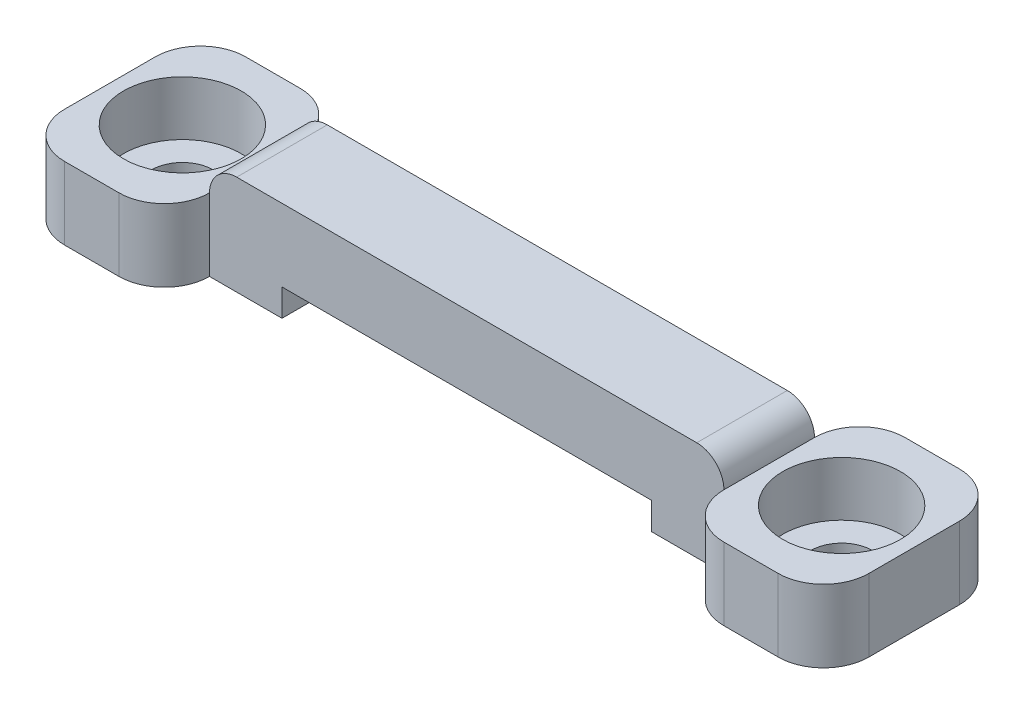
ISO-10303-21;
HEADER;
FILE_DESCRIPTION(('STEP AP214'),'2;1');
FILE_NAME('part.step','',(''),(''),'','','');
FILE_SCHEMA(('AUTOMOTIVE_DESIGN { 1 0 10303 214 1 1 1 1 }'));
ENDSEC;
DATA;
#1=APPLICATION_CONTEXT('core data for automotive mechanical design processes');
#2=APPLICATION_PROTOCOL_DEFINITION('international standard','automotive_design',2000,#1);
#3=PRODUCT_CONTEXT('',#1,'mechanical');
#4=PRODUCT('Part','Part','',(#3));
#5=PRODUCT_RELATED_PRODUCT_CATEGORY('part','',(#4));
#6=PRODUCT_DEFINITION_FORMATION('','',#4);
#7=PRODUCT_DEFINITION_CONTEXT('part definition',#1,'design');
#8=PRODUCT_DEFINITION('design','',#6,#7);
#9=PRODUCT_DEFINITION_SHAPE('','',#8);
#10=(LENGTH_UNIT() NAMED_UNIT(*) SI_UNIT(.MILLI.,.METRE.));
#11=(NAMED_UNIT(*) PLANE_ANGLE_UNIT() SI_UNIT($,.RADIAN.));
#12=(NAMED_UNIT(*) SI_UNIT($,.STERADIAN.) SOLID_ANGLE_UNIT());
#13=UNCERTAINTY_MEASURE_WITH_UNIT(LENGTH_MEASURE(1.E-05),#10,'distance_accuracy_value','');
#14=(GEOMETRIC_REPRESENTATION_CONTEXT(3) GLOBAL_UNCERTAINTY_ASSIGNED_CONTEXT((#13)) GLOBAL_UNIT_ASSIGNED_CONTEXT((#10,
#11,#12)) REPRESENTATION_CONTEXT('',''));
#15=CARTESIAN_POINT('',(0.,0.,0.));
#16=DIRECTION('',(0.,0.,1.));
#17=DIRECTION('',(1.,0.,0.));
#18=AXIS2_PLACEMENT_3D('',#15,#16,#17);
#19=CARTESIAN_POINT('',(0.,0.,0.));
#20=DIRECTION('',(0.,0.,1.));
#21=DIRECTION('',(1.,0.,0.));
#22=AXIS2_PLACEMENT_3D('',#19,#20,#21);
#23=PLANE('',#22);
#24=DIRECTION('',(-1.,0.,0.));
#25=VECTOR('',#24,1.);
#26=CARTESIAN_POINT('',(44.4,4.00000000000001,0.));
#27=LINE('',#26,#25);
#28=CARTESIAN_POINT('',(41.9,4.00000000000001,0.));
#29=VERTEX_POINT('',#28);
#30=CARTESIAN_POINT('',(38.9,4.00000000000001,0.));
#31=VERTEX_POINT('',#30);
#32=EDGE_CURVE('E411',#29,#31,#27,.T.);
#33=ORIENTED_EDGE('',*,*,#32,.F.);
#34=DIRECTION('',(0.,1.,0.));
#35=VECTOR('',#34,1.);
#36=CARTESIAN_POINT('',(41.9,0.,0.));
#37=LINE('',#36,#35);
#38=CARTESIAN_POINT('',(41.9,0.,0.));
#39=VERTEX_POINT('',#38);
#40=EDGE_CURVE('E245',#29,#39,#37,.F.);
#41=ORIENTED_EDGE('',*,*,#40,.T.);
#42=DIRECTION('',(1.,0.,0.));
#43=VECTOR('',#42,1.);
#44=CARTESIAN_POINT('',(32.4,0.,0.));
#45=LINE('',#44,#43);
#46=CARTESIAN_POINT('',(38.9,0.,0.));
#47=VERTEX_POINT('',#46);
#48=EDGE_CURVE('E407',#47,#39,#45,.T.);
#49=ORIENTED_EDGE('',*,*,#48,.F.);
#50=DIRECTION('',(0.,1.,0.));
#51=VECTOR('',#50,1.);
#52=CARTESIAN_POINT('',(38.9,0.,0.));
#53=LINE('',#52,#51);
#54=EDGE_CURVE('E218',#47,#31,#53,.T.);
#55=ORIENTED_EDGE('',*,*,#54,.T.);
#56=EDGE_LOOP('',(#33,#41,#49,#55));
#57=FACE_BOUND('',#56,.T.);
#58=ADVANCED_FACE('F39',(#57),#23,.F.);
#59=CARTESIAN_POINT('',(12.,0.,10.));
#60=DIRECTION('',(-1.,0.,0.));
#61=DIRECTION('',(0.,0.,1.));
#62=AXIS2_PLACEMENT_3D('',#59,#60,#61);
#63=PLANE('',#62);
#64=DIRECTION('',(0.,0.,-1.));
#65=VECTOR('',#64,1.);
#66=CARTESIAN_POINT('',(12.,0.,10.));
#67=LINE('',#66,#65);
#68=CARTESIAN_POINT('',(12.,0.,7.5));
#69=VERTEX_POINT('',#68);
#70=CARTESIAN_POINT('',(12.,0.,2.5));
#71=VERTEX_POINT('',#70);
#72=EDGE_CURVE('E320',#69,#71,#67,.T.);
#73=ORIENTED_EDGE('',*,*,#72,.T.);
#74=DIRECTION('',(0.,1.,0.));
#75=VECTOR('',#74,1.);
#76=CARTESIAN_POINT('',(12.,0.,2.5));
#77=LINE('',#76,#75);
#78=CARTESIAN_POINT('',(12.,1.5,2.5));
#79=VERTEX_POINT('',#78);
#80=EDGE_CURVE('E288',#71,#79,#77,.T.);
#81=ORIENTED_EDGE('',*,*,#80,.T.);
#82=DIRECTION('',(0.,0.,-1.));
#83=VECTOR('',#82,1.);
#84=CARTESIAN_POINT('',(12.,1.5,10.));
#85=LINE('',#84,#83);
#86=CARTESIAN_POINT('',(12.,1.5,7.5));
#87=VERTEX_POINT('',#86);
#88=EDGE_CURVE('E316',#87,#79,#85,.T.);
#89=ORIENTED_EDGE('',*,*,#88,.F.);
#90=DIRECTION('',(0.,1.,0.));
#91=VECTOR('',#90,1.);
#92=CARTESIAN_POINT('',(12.,0.,7.5));
#93=LINE('',#92,#91);
#94=EDGE_CURVE('E455',#69,#87,#93,.T.);
#95=ORIENTED_EDGE('',*,*,#94,.F.);
#96=EDGE_LOOP('',(#73,#81,#89,#95));
#97=FACE_BOUND('',#96,.T.);
#98=ADVANCED_FACE('F518',(#97),#63,.F.);
#99=CARTESIAN_POINT('',(12.,1.5,10.));
#100=DIRECTION('',(0.,1.,0.));
#101=DIRECTION('',(-1.,0.,0.));
#102=AXIS2_PLACEMENT_3D('',#99,#100,#101);
#103=PLANE('',#102);
#104=ORIENTED_EDGE('',*,*,#88,.T.);
#105=DIRECTION('',(1.,0.,0.));
#106=VECTOR('',#105,1.);
#107=CARTESIAN_POINT('',(12.,1.5,2.5));
#108=LINE('',#107,#106);
#109=CARTESIAN_POINT('',(32.4,1.50000000000001,2.5));
#110=VERTEX_POINT('',#109);
#111=EDGE_CURVE('E475',#79,#110,#108,.T.);
#112=ORIENTED_EDGE('',*,*,#111,.T.);
#113=DIRECTION('',(0.,0.,-1.));
#114=VECTOR('',#113,1.);
#115=CARTESIAN_POINT('',(32.4,1.50000000000001,10.));
#116=LINE('',#115,#114);
#117=CARTESIAN_POINT('',(32.4,1.50000000000001,7.5));
#118=VERTEX_POINT('',#117);
#119=EDGE_CURVE('E312',#118,#110,#116,.T.);
#120=ORIENTED_EDGE('',*,*,#119,.F.);
#121=DIRECTION('',(1.,0.,0.));
#122=VECTOR('',#121,1.);
#123=CARTESIAN_POINT('',(12.,1.5,7.5));
#124=LINE('',#123,#122);
#125=EDGE_CURVE('E458',#87,#118,#124,.T.);
#126=ORIENTED_EDGE('',*,*,#125,.F.);
#127=EDGE_LOOP('',(#104,#112,#120,#126));
#128=FACE_BOUND('',#127,.T.);
#129=ADVANCED_FACE('F520',(#128),#103,.F.);
#130=CARTESIAN_POINT('',(32.4,1.50000000000001,10.));
#131=DIRECTION('',(1.,0.,0.));
#132=DIRECTION('',(0.,0.,-1.));
#133=AXIS2_PLACEMENT_3D('',#130,#131,#132);
#134=PLANE('',#133);
#135=ORIENTED_EDGE('',*,*,#119,.T.);
#136=DIRECTION('',(0.,-1.,0.));
#137=VECTOR('',#136,1.);
#138=CARTESIAN_POINT('',(32.4,1.50000000000001,2.5));
#139=LINE('',#138,#137);
#140=CARTESIAN_POINT('',(32.4,0.,2.5));
#141=VERTEX_POINT('',#140);
#142=EDGE_CURVE('E479',#110,#141,#139,.T.);
#143=ORIENTED_EDGE('',*,*,#142,.T.);
#144=DIRECTION('',(0.,0.,-1.));
#145=VECTOR('',#144,1.);
#146=CARTESIAN_POINT('',(32.4,0.,10.));
#147=LINE('',#146,#145);
#148=CARTESIAN_POINT('',(32.4,0.,7.5));
#149=VERTEX_POINT('',#148);
#150=EDGE_CURVE('E211',#149,#141,#147,.T.);
#151=ORIENTED_EDGE('',*,*,#150,.F.);
#152=DIRECTION('',(0.,-1.,0.));
#153=VECTOR('',#152,1.);
#154=CARTESIAN_POINT('',(32.4,1.50000000000001,7.5));
#155=LINE('',#154,#153);
#156=EDGE_CURVE('E461',#118,#149,#155,.T.);
#157=ORIENTED_EDGE('',*,*,#156,.F.);
#158=EDGE_LOOP('',(#135,#143,#151,#157));
#159=FACE_BOUND('',#158,.T.);
#160=ADVANCED_FACE('F525',(#159),#134,.F.);
#161=CARTESIAN_POINT('',(36.4,5.5,10.));
#162=DIRECTION('',(0.,-1.,0.));
#163=DIRECTION('',(1.,0.,0.));
#164=AXIS2_PLACEMENT_3D('',#161,#162,#163);
#165=PLANE('',#164);
#166=DIRECTION('',(-1.,0.,0.));
#167=VECTOR('',#166,1.);
#168=CARTESIAN_POINT('',(8.,5.5,7.5));
#169=LINE('',#168,#167);
#170=CARTESIAN_POINT('',(34.9,5.5,7.5));
#171=VERTEX_POINT('',#170);
#172=CARTESIAN_POINT('',(9.5,5.5,7.5));
#173=VERTEX_POINT('',#172);
#174=EDGE_CURVE('E266',#171,#173,#169,.T.);
#175=ORIENTED_EDGE('',*,*,#174,.F.);
#176=DIRECTION('',(0.,0.,-1.));
#177=VECTOR('',#176,1.);
#178=CARTESIAN_POINT('',(34.9,5.5,10.));
#179=LINE('',#178,#177);
#180=CARTESIAN_POINT('',(34.9,5.5,2.5));
#181=VERTEX_POINT('',#180);
#182=EDGE_CURVE('E250',#171,#181,#179,.T.);
#183=ORIENTED_EDGE('',*,*,#182,.T.);
#184=DIRECTION('',(1.,0.,0.));
#185=VECTOR('',#184,1.);
#186=CARTESIAN_POINT('',(36.4,5.5,2.5));
#187=LINE('',#186,#185);
#188=CARTESIAN_POINT('',(9.5,5.5,2.5));
#189=VERTEX_POINT('',#188);
#190=EDGE_CURVE('E482',#189,#181,#187,.T.);
#191=ORIENTED_EDGE('',*,*,#190,.F.);
#192=DIRECTION('',(0.,0.,-1.));
#193=VECTOR('',#192,1.);
#194=CARTESIAN_POINT('',(9.5,5.5,10.));
#195=LINE('',#194,#193);
#196=EDGE_CURVE('E55',#189,#173,#195,.F.);
#197=ORIENTED_EDGE('',*,*,#196,.T.);
#198=EDGE_LOOP('',(#175,#183,#191,#197));
#199=FACE_BOUND('',#198,.T.);
#200=ADVANCED_FACE('F528',(#199),#165,.F.);
#201=CARTESIAN_POINT('',(0.,0.,10.));
#202=DIRECTION('',(0.,0.,1.));
#203=DIRECTION('',(1.,0.,0.));
#204=AXIS2_PLACEMENT_3D('',#201,#202,#203);
#205=PLANE('',#204);
#206=DIRECTION('',(1.,0.,0.));
#207=VECTOR('',#206,1.);
#208=CARTESIAN_POINT('',(0.,0.,10.));
#209=LINE('',#208,#207);
#210=CARTESIAN_POINT('',(2.5,0.,10.));
#211=VERTEX_POINT('',#210);
#212=CARTESIAN_POINT('',(5.5,0.,10.));
#213=VERTEX_POINT('',#212);
#214=EDGE_CURVE('E399',#211,#213,#209,.T.);
#215=ORIENTED_EDGE('',*,*,#214,.T.);
#216=DIRECTION('',(0.,-1.,0.));
#217=VECTOR('',#216,1.);
#218=CARTESIAN_POINT('',(5.5,4.,10.));
#219=LINE('',#218,#217);
#220=CARTESIAN_POINT('',(5.5,4.,10.));
#221=VERTEX_POINT('',#220);
#222=EDGE_CURVE('E343',#213,#221,#219,.F.);
#223=ORIENTED_EDGE('',*,*,#222,.T.);
#224=DIRECTION('',(-1.,0.,0.));
#225=VECTOR('',#224,1.);
#226=CARTESIAN_POINT('',(8.,4.,10.));
#227=LINE('',#226,#225);
#228=CARTESIAN_POINT('',(2.5,4.,10.));
#229=VERTEX_POINT('',#228);
#230=EDGE_CURVE('E277',#221,#229,#227,.T.);
#231=ORIENTED_EDGE('',*,*,#230,.T.);
#232=DIRECTION('',(0.,-1.,0.));
#233=VECTOR('',#232,1.);
#234=CARTESIAN_POINT('',(2.5,0.,10.));
#235=LINE('',#234,#233);
#236=EDGE_CURVE('E339',#229,#211,#235,.T.);
#237=ORIENTED_EDGE('',*,*,#236,.T.);
#238=EDGE_LOOP('',(#215,#223,#231,#237));
#239=FACE_BOUND('',#238,.T.);
#240=ADVANCED_FACE('F510',(#239),#205,.T.);
#241=CARTESIAN_POINT('',(0.,4.,10.));
#242=DIRECTION('',(1.,0.,0.));
#243=DIRECTION('',(0.,1.,0.));
#244=AXIS2_PLACEMENT_3D('',#241,#242,#243);
#245=PLANE('',#244);
#246=DIRECTION('',(0.,0.,-1.));
#247=VECTOR('',#246,1.);
#248=CARTESIAN_POINT('',(0.,0.,10.));
#249=LINE('',#248,#247);
#250=CARTESIAN_POINT('',(0.,0.,7.5));
#251=VERTEX_POINT('',#250);
#252=CARTESIAN_POINT('',(0.,0.,2.5));
#253=VERTEX_POINT('',#252);
#254=EDGE_CURVE('E324',#251,#253,#249,.T.);
#255=ORIENTED_EDGE('',*,*,#254,.F.);
#256=DIRECTION('',(0.,-1.,0.));
#257=VECTOR('',#256,1.);
#258=CARTESIAN_POINT('',(0.,4.,7.5));
#259=LINE('',#258,#257);
#260=CARTESIAN_POINT('',(0.,4.,7.5));
#261=VERTEX_POINT('',#260);
#262=EDGE_CURVE('E357',#251,#261,#259,.F.);
#263=ORIENTED_EDGE('',*,*,#262,.T.);
#264=DIRECTION('',(0.,0.,-1.));
#265=VECTOR('',#264,1.);
#266=CARTESIAN_POINT('',(0.,4.,10.));
#267=LINE('',#266,#265);
#268=CARTESIAN_POINT('',(0.,4.,2.5));
#269=VERTEX_POINT('',#268);
#270=EDGE_CURVE('E293',#261,#269,#267,.T.);
#271=ORIENTED_EDGE('',*,*,#270,.T.);
#272=DIRECTION('',(0.,-1.,0.));
#273=VECTOR('',#272,1.);
#274=CARTESIAN_POINT('',(0.,4.,2.5));
#275=LINE('',#274,#273);
#276=EDGE_CURVE('E281',#269,#253,#275,.T.);
#277=ORIENTED_EDGE('',*,*,#276,.T.);
#278=EDGE_LOOP('',(#255,#263,#271,#277));
#279=FACE_BOUND('',#278,.T.);
#280=ADVANCED_FACE('F505',(#279),#245,.F.);
#281=CARTESIAN_POINT('',(0.,0.,10.));
#282=DIRECTION('',(0.,1.,0.));
#283=DIRECTION('',(-1.,0.,0.));
#284=AXIS2_PLACEMENT_3D('',#281,#282,#283);
#285=PLANE('',#284);
#286=CARTESIAN_POINT('',(4.,0.,5.00000000000001));
#287=DIRECTION('',(0.,1.,0.));
#288=DIRECTION('',(0.,0.,1.));
#289=AXIS2_PLACEMENT_3D('',#286,#287,#288);
#290=CIRCLE('',#289,1.7);
#291=CARTESIAN_POINT('',(4.,0.,6.70000000000001));
#292=VERTEX_POINT('',#291);
#293=EDGE_CURVE('E439',#292,#292,#290,.T.);
#294=ORIENTED_EDGE('',*,*,#293,.T.);
#295=EDGE_LOOP('',(#294));
#296=FACE_BOUND('',#295,.T.);
#297=DIRECTION('',(1.,0.,0.));
#298=VECTOR('',#297,1.);
#299=CARTESIAN_POINT('',(8.,0.,7.5));
#300=LINE('',#299,#298);
#301=CARTESIAN_POINT('',(8.,0.,7.5));
#302=VERTEX_POINT('',#301);
#303=EDGE_CURVE('E469',#302,#69,#300,.T.);
#304=ORIENTED_EDGE('',*,*,#303,.F.);
#305=CARTESIAN_POINT('',(5.5,0.,7.5));
#306=DIRECTION('',(0.,1.,0.));
#307=DIRECTION('',(-1.,0.,0.));
#308=AXIS2_PLACEMENT_3D('',#305,#306,#307);
#309=CIRCLE('',#308,2.5);
#310=EDGE_CURVE('E285',#302,#213,#309,.F.);
#311=ORIENTED_EDGE('',*,*,#310,.T.);
#312=ORIENTED_EDGE('',*,*,#214,.F.);
#313=CARTESIAN_POINT('',(2.5,0.,7.5));
#314=DIRECTION('',(0.,1.,0.));
#315=DIRECTION('',(-1.,0.,0.));
#316=AXIS2_PLACEMENT_3D('',#313,#314,#315);
#317=CIRCLE('',#316,2.5);
#318=EDGE_CURVE('E334',#211,#251,#317,.F.);
#319=ORIENTED_EDGE('',*,*,#318,.T.);
#320=ORIENTED_EDGE('',*,*,#254,.T.);
#321=CARTESIAN_POINT('',(2.5,0.,2.5));
#322=DIRECTION('',(0.,1.,0.));
#323=DIRECTION('',(-1.,0.,0.));
#324=AXIS2_PLACEMENT_3D('',#321,#322,#323);
#325=CIRCLE('',#324,2.5);
#326=CARTESIAN_POINT('',(2.5,0.,0.));
#327=VERTEX_POINT('',#326);
#328=EDGE_CURVE('E331',#253,#327,#325,.F.);
#329=ORIENTED_EDGE('',*,*,#328,.T.);
#330=DIRECTION('',(1.,0.,0.));
#331=VECTOR('',#330,1.);
#332=CARTESIAN_POINT('',(0.,0.,0.));
#333=LINE('',#332,#331);
#334=CARTESIAN_POINT('',(5.5,0.,0.));
#335=VERTEX_POINT('',#334);
#336=EDGE_CURVE('E403',#327,#335,#333,.T.);
#337=ORIENTED_EDGE('',*,*,#336,.T.);
#338=CARTESIAN_POINT('',(5.5,0.,2.5));
#339=DIRECTION('',(0.,1.,0.));
#340=DIRECTION('',(-1.,0.,0.));
#341=AXIS2_PLACEMENT_3D('',#338,#339,#340);
#342=CIRCLE('',#341,2.5);
#343=CARTESIAN_POINT('',(8.,0.,2.5));
#344=VERTEX_POINT('',#343);
#345=EDGE_CURVE('E328',#335,#344,#342,.F.);
#346=ORIENTED_EDGE('',*,*,#345,.T.);
#347=DIRECTION('',(-1.,0.,0.));
#348=VECTOR('',#347,1.);
#349=CARTESIAN_POINT('',(36.4,0.,2.5));
#350=LINE('',#349,#348);
#351=EDGE_CURVE('E200',#71,#344,#350,.T.);
#352=ORIENTED_EDGE('',*,*,#351,.F.);
#353=ORIENTED_EDGE('',*,*,#72,.F.);
#354=EDGE_LOOP('',(#304,#311,#312,#319,#320,#329,#337,#346,#352,#353));
#355=FACE_BOUND('',#354,.T.);
#356=ADVANCED_FACE('F512',(#296,#355),#285,.F.);
#357=CARTESIAN_POINT('',(32.4,0.,10.));
#358=DIRECTION('',(0.,1.,0.));
#359=DIRECTION('',(-1.,0.,0.));
#360=AXIS2_PLACEMENT_3D('',#357,#358,#359);
#361=PLANE('',#360);
#362=CARTESIAN_POINT('',(40.4,0.,5.));
#363=DIRECTION('',(0.,1.,0.));
#364=DIRECTION('',(0.,0.,1.));
#365=AXIS2_PLACEMENT_3D('',#362,#363,#364);
#366=CIRCLE('',#365,1.7);
#367=CARTESIAN_POINT('',(40.4,0.,6.7));
#368=VERTEX_POINT('',#367);
#369=EDGE_CURVE('E408',#368,#368,#366,.T.);
#370=ORIENTED_EDGE('',*,*,#369,.T.);
#371=EDGE_LOOP('',(#370));
#372=FACE_BOUND('',#371,.T.);
#373=DIRECTION('',(1.,0.,0.));
#374=VECTOR('',#373,1.);
#375=CARTESIAN_POINT('',(32.4,0.,10.));
#376=LINE('',#375,#374);
#377=CARTESIAN_POINT('',(38.9,0.,10.));
#378=VERTEX_POINT('',#377);
#379=CARTESIAN_POINT('',(41.9,0.,10.));
#380=VERTEX_POINT('',#379);
#381=EDGE_CURVE('E387',#378,#380,#376,.T.);
#382=ORIENTED_EDGE('',*,*,#381,.F.);
#383=CARTESIAN_POINT('',(38.9,0.,7.5));
#384=DIRECTION('',(0.,1.,0.));
#385=DIRECTION('',(-1.,0.,0.));
#386=AXIS2_PLACEMENT_3D('',#383,#384,#385);
#387=CIRCLE('',#386,2.5);
#388=CARTESIAN_POINT('',(36.4,0.,7.5));
#389=VERTEX_POINT('',#388);
#390=EDGE_CURVE('E233',#378,#389,#387,.F.);
#391=ORIENTED_EDGE('',*,*,#390,.T.);
#392=EDGE_CURVE('E287',#149,#389,#300,.T.);
#393=ORIENTED_EDGE('',*,*,#392,.F.);
#394=ORIENTED_EDGE('',*,*,#150,.T.);
#395=CARTESIAN_POINT('',(36.4,0.,2.5));
#396=VERTEX_POINT('',#395);
#397=EDGE_CURVE('E192',#396,#141,#350,.T.);
#398=ORIENTED_EDGE('',*,*,#397,.F.);
#399=CARTESIAN_POINT('',(38.9,0.,2.5));
#400=DIRECTION('',(0.,1.,0.));
#401=DIRECTION('',(-1.,0.,0.));
#402=AXIS2_PLACEMENT_3D('',#399,#400,#401);
#403=CIRCLE('',#402,2.5);
#404=EDGE_CURVE('E207',#396,#47,#403,.F.);
#405=ORIENTED_EDGE('',*,*,#404,.T.);
#406=ORIENTED_EDGE('',*,*,#48,.T.);
#407=CARTESIAN_POINT('',(41.9,0.,2.5));
#408=DIRECTION('',(0.,1.,0.));
#409=DIRECTION('',(-1.,0.,0.));
#410=AXIS2_PLACEMENT_3D('',#407,#408,#409);
#411=CIRCLE('',#410,2.5);
#412=CARTESIAN_POINT('',(44.4,0.,2.5));
#413=VERTEX_POINT('',#412);
#414=EDGE_CURVE('E220',#39,#413,#411,.F.);
#415=ORIENTED_EDGE('',*,*,#414,.T.);
#416=DIRECTION('',(0.,0.,-1.));
#417=VECTOR('',#416,1.);
#418=CARTESIAN_POINT('',(44.4,0.,10.));
#419=LINE('',#418,#417);
#420=CARTESIAN_POINT('',(44.4,0.,7.5));
#421=VERTEX_POINT('',#420);
#422=EDGE_CURVE('E306',#421,#413,#419,.T.);
#423=ORIENTED_EDGE('',*,*,#422,.F.);
#424=CARTESIAN_POINT('',(41.9,0.,7.5));
#425=DIRECTION('',(0.,1.,0.));
#426=DIRECTION('',(-1.,0.,0.));
#427=AXIS2_PLACEMENT_3D('',#424,#425,#426);
#428=CIRCLE('',#427,2.5);
#429=EDGE_CURVE('E225',#421,#380,#428,.F.);
#430=ORIENTED_EDGE('',*,*,#429,.T.);
#431=EDGE_LOOP('',(#382,#391,#393,#394,#398,#405,#406,#415,#423,#430));
#432=FACE_BOUND('',#431,.T.);
#433=ADVANCED_FACE('F205',(#372,#432),#361,.F.);
#434=CARTESIAN_POINT('',(44.4,0.,10.));
#435=DIRECTION('',(-1.,0.,0.));
#436=DIRECTION('',(0.,0.,1.));
#437=AXIS2_PLACEMENT_3D('',#434,#435,#436);
#438=PLANE('',#437);
#439=DIRECTION('',(0.,0.,-1.));
#440=VECTOR('',#439,1.);
#441=CARTESIAN_POINT('',(44.4,4.00000000000001,10.));
#442=LINE('',#441,#440);
#443=CARTESIAN_POINT('',(44.4,4.00000000000001,7.5));
#444=VERTEX_POINT('',#443);
#445=CARTESIAN_POINT('',(44.4,4.00000000000001,2.5));
#446=VERTEX_POINT('',#445);
#447=EDGE_CURVE('E297',#444,#446,#442,.T.);
#448=ORIENTED_EDGE('',*,*,#447,.F.);
#449=DIRECTION('',(0.,1.,0.));
#450=VECTOR('',#449,1.);
#451=CARTESIAN_POINT('',(44.4,0.,7.5));
#452=LINE('',#451,#450);
#453=EDGE_CURVE('E240',#444,#421,#452,.F.);
#454=ORIENTED_EDGE('',*,*,#453,.T.);
#455=ORIENTED_EDGE('',*,*,#422,.T.);
#456=DIRECTION('',(0.,1.,0.));
#457=VECTOR('',#456,1.);
#458=CARTESIAN_POINT('',(44.4,0.,2.5));
#459=LINE('',#458,#457);
#460=EDGE_CURVE('E236',#413,#446,#459,.T.);
#461=ORIENTED_EDGE('',*,*,#460,.T.);
#462=EDGE_LOOP('',(#448,#454,#455,#461));
#463=FACE_BOUND('',#462,.T.);
#464=ADVANCED_FACE('F603',(#463),#438,.F.);
#465=CARTESIAN_POINT('',(44.4,4.00000000000001,10.));
#466=DIRECTION('',(0.,-1.,0.));
#467=DIRECTION('',(1.,0.,0.));
#468=AXIS2_PLACEMENT_3D('',#465,#466,#467);
#469=PLANE('',#468);
#470=CARTESIAN_POINT('',(40.4,4.00000000000001,5.));
#471=DIRECTION('',(0.,1.,0.));
#472=DIRECTION('',(0.,0.,1.));
#473=AXIS2_PLACEMENT_3D('',#470,#471,#472);
#474=CIRCLE('',#473,3.25);
#475=CARTESIAN_POINT('',(40.4,4.00000000000001,8.25));
#476=VERTEX_POINT('',#475);
#477=EDGE_CURVE('E435',#476,#476,#474,.T.);
#478=ORIENTED_EDGE('',*,*,#477,.F.);
#479=EDGE_LOOP('',(#478));
#480=FACE_BOUND('',#479,.T.);
#481=DIRECTION('',(0.,0.,-1.));
#482=VECTOR('',#481,1.);
#483=CARTESIAN_POINT('',(36.4,4.00000000000001,10.));
#484=LINE('',#483,#482);
#485=CARTESIAN_POINT('',(36.4,4.00000000000001,7.5));
#486=VERTEX_POINT('',#485);
#487=CARTESIAN_POINT('',(36.4,4.00000000000001,2.5));
#488=VERTEX_POINT('',#487);
#489=EDGE_CURVE('E292',#486,#488,#484,.T.);
#490=ORIENTED_EDGE('',*,*,#489,.F.);
#491=CARTESIAN_POINT('',(38.9,4.00000000000001,7.5));
#492=DIRECTION('',(0.,-1.,0.));
#493=DIRECTION('',(1.,0.,0.));
#494=AXIS2_PLACEMENT_3D('',#491,#492,#493);
#495=CIRCLE('',#494,2.5);
#496=CARTESIAN_POINT('',(38.9,4.00000000000001,10.));
#497=VERTEX_POINT('',#496);
#498=EDGE_CURVE('E375',#486,#497,#495,.F.);
#499=ORIENTED_EDGE('',*,*,#498,.T.);
#500=DIRECTION('',(-1.,0.,0.));
#501=VECTOR('',#500,1.);
#502=CARTESIAN_POINT('',(44.4,4.00000000000001,10.));
#503=LINE('',#502,#501);
#504=CARTESIAN_POINT('',(41.9,4.00000000000001,10.));
#505=VERTEX_POINT('',#504);
#506=EDGE_CURVE('E385',#505,#497,#503,.T.);
#507=ORIENTED_EDGE('',*,*,#506,.F.);
#508=CARTESIAN_POINT('',(41.9,4.00000000000001,7.5));
#509=DIRECTION('',(0.,-1.,0.));
#510=DIRECTION('',(1.,0.,0.));
#511=AXIS2_PLACEMENT_3D('',#508,#509,#510);
#512=CIRCLE('',#511,2.5);
#513=EDGE_CURVE('E372',#505,#444,#512,.F.);
#514=ORIENTED_EDGE('',*,*,#513,.T.);
#515=ORIENTED_EDGE('',*,*,#447,.T.);
#516=CARTESIAN_POINT('',(41.9,4.00000000000001,2.5));
#517=DIRECTION('',(0.,-1.,0.));
#518=DIRECTION('',(1.,0.,0.));
#519=AXIS2_PLACEMENT_3D('',#516,#517,#518);
#520=CIRCLE('',#519,2.5);
#521=EDGE_CURVE('E369',#446,#29,#520,.F.);
#522=ORIENTED_EDGE('',*,*,#521,.T.);
#523=ORIENTED_EDGE('',*,*,#32,.T.);
#524=CARTESIAN_POINT('',(38.9,4.00000000000001,2.5));
#525=DIRECTION('',(0.,-1.,0.));
#526=DIRECTION('',(1.,0.,0.));
#527=AXIS2_PLACEMENT_3D('',#524,#525,#526);
#528=CIRCLE('',#527,2.5);
#529=EDGE_CURVE('E366',#31,#488,#528,.F.);
#530=ORIENTED_EDGE('',*,*,#529,.T.);
#531=EDGE_LOOP('',(#490,#499,#507,#514,#515,#522,#523,#530));
#532=FACE_BOUND('',#531,.T.);
#533=ADVANCED_FACE('F392',(#480,#532),#469,.F.);
#534=CARTESIAN_POINT('',(8.,4.,10.));
#535=DIRECTION('',(0.,-1.,0.));
#536=DIRECTION('',(1.,0.,0.));
#537=AXIS2_PLACEMENT_3D('',#534,#535,#536);
#538=PLANE('',#537);
#539=CARTESIAN_POINT('',(4.,4.,5.00000000000001));
#540=DIRECTION('',(0.,1.,0.));
#541=DIRECTION('',(0.,0.,1.));
#542=AXIS2_PLACEMENT_3D('',#539,#540,#541);
#543=CIRCLE('',#542,3.25);
#544=CARTESIAN_POINT('',(4.,4.,8.25000000000001));
#545=VERTEX_POINT('',#544);
#546=EDGE_CURVE('E451',#545,#545,#543,.T.);
#547=ORIENTED_EDGE('',*,*,#546,.F.);
#548=EDGE_LOOP('',(#547));
#549=FACE_BOUND('',#548,.T.);
#550=ORIENTED_EDGE('',*,*,#230,.F.);
#551=CARTESIAN_POINT('',(5.5,4.,7.5));
#552=DIRECTION('',(0.,-1.,0.));
#553=DIRECTION('',(1.,0.,0.));
#554=AXIS2_PLACEMENT_3D('',#551,#552,#553);
#555=CIRCLE('',#554,2.5);
#556=CARTESIAN_POINT('',(8.,4.,7.5));
#557=VERTEX_POINT('',#556);
#558=EDGE_CURVE('E273',#221,#557,#555,.F.);
#559=ORIENTED_EDGE('',*,*,#558,.T.);
#560=DIRECTION('',(0.,0.,-1.));
#561=VECTOR('',#560,1.);
#562=CARTESIAN_POINT('',(8.,4.,10.));
#563=LINE('',#562,#561);
#564=CARTESIAN_POINT('',(8.,4.,2.5));
#565=VERTEX_POINT('',#564);
#566=EDGE_CURVE('E275',#557,#565,#563,.T.);
#567=ORIENTED_EDGE('',*,*,#566,.T.);
#568=CARTESIAN_POINT('',(5.5,4.,2.5));
#569=DIRECTION('',(0.,-1.,0.));
#570=DIRECTION('',(1.,0.,0.));
#571=AXIS2_PLACEMENT_3D('',#568,#569,#570);
#572=CIRCLE('',#571,2.5);
#573=CARTESIAN_POINT('',(5.5,4.,0.));
#574=VERTEX_POINT('',#573);
#575=EDGE_CURVE('E346',#565,#574,#572,.F.);
#576=ORIENTED_EDGE('',*,*,#575,.T.);
#577=DIRECTION('',(-1.,0.,0.));
#578=VECTOR('',#577,1.);
#579=CARTESIAN_POINT('',(8.,4.,0.));
#580=LINE('',#579,#578);
#581=CARTESIAN_POINT('',(2.5,4.,0.));
#582=VERTEX_POINT('',#581);
#583=EDGE_CURVE('E414',#574,#582,#580,.T.);
#584=ORIENTED_EDGE('',*,*,#583,.T.);
#585=CARTESIAN_POINT('',(2.5,4.,2.5));
#586=DIRECTION('',(0.,-1.,0.));
#587=DIRECTION('',(1.,0.,0.));
#588=AXIS2_PLACEMENT_3D('',#585,#586,#587);
#589=CIRCLE('',#588,2.5);
#590=EDGE_CURVE('E349',#582,#269,#589,.F.);
#591=ORIENTED_EDGE('',*,*,#590,.T.);
#592=ORIENTED_EDGE('',*,*,#270,.F.);
#593=CARTESIAN_POINT('',(2.5,4.,7.5));
#594=DIRECTION('',(0.,-1.,0.));
#595=DIRECTION('',(1.,0.,0.));
#596=AXIS2_PLACEMENT_3D('',#593,#594,#595);
#597=CIRCLE('',#596,2.5);
#598=EDGE_CURVE('E282',#261,#229,#597,.F.);
#599=ORIENTED_EDGE('',*,*,#598,.T.);
#600=EDGE_LOOP('',(#550,#559,#567,#576,#584,#591,#592,#599));
#601=FACE_BOUND('',#600,.T.);
#602=ADVANCED_FACE('F274',(#549,#601),#538,.F.);
#603=ORIENTED_EDGE('',*,*,#506,.T.);
#604=DIRECTION('',(0.,1.,0.));
#605=VECTOR('',#604,1.);
#606=CARTESIAN_POINT('',(38.9,0.,10.));
#607=LINE('',#606,#605);
#608=EDGE_CURVE('E221',#497,#378,#607,.F.);
#609=ORIENTED_EDGE('',*,*,#608,.T.);
#610=ORIENTED_EDGE('',*,*,#381,.T.);
#611=DIRECTION('',(0.,1.,0.));
#612=VECTOR('',#611,1.);
#613=CARTESIAN_POINT('',(41.9,4.00000000000001,10.));
#614=LINE('',#613,#612);
#615=EDGE_CURVE('E227',#380,#505,#614,.T.);
#616=ORIENTED_EDGE('',*,*,#615,.T.);
#617=EDGE_LOOP('',(#603,#609,#610,#616));
#618=FACE_BOUND('',#617,.T.);
#619=ADVANCED_FACE('F384',(#618),#205,.T.);
#620=ORIENTED_EDGE('',*,*,#336,.F.);
#621=DIRECTION('',(0.,-1.,0.));
#622=VECTOR('',#621,1.);
#623=CARTESIAN_POINT('',(2.5,0.,0.));
#624=LINE('',#623,#622);
#625=EDGE_CURVE('E363',#327,#582,#624,.F.);
#626=ORIENTED_EDGE('',*,*,#625,.T.);
#627=ORIENTED_EDGE('',*,*,#583,.F.);
#628=DIRECTION('',(0.,1.,0.));
#629=VECTOR('',#628,1.);
#630=CARTESIAN_POINT('',(5.5,0.,0.));
#631=LINE('',#630,#629);
#632=EDGE_CURVE('E360',#574,#335,#631,.F.);
#633=ORIENTED_EDGE('',*,*,#632,.T.);
#634=EDGE_LOOP('',(#620,#626,#627,#633));
#635=FACE_BOUND('',#634,.T.);
#636=ADVANCED_FACE('F496',(#635),#23,.F.);
#637=CARTESIAN_POINT('',(40.4,4.00000000000001,5.));
#638=DIRECTION('',(0.,1.,0.));
#639=DIRECTION('',(0.,0.,1.));
#640=AXIS2_PLACEMENT_3D('',#637,#638,#639);
#641=CYLINDRICAL_SURFACE('',#640,1.7);
#642=ORIENTED_EDGE('',*,*,#369,.F.);
#643=EDGE_LOOP('',(#642));
#644=FACE_BOUND('',#643,.T.);
#645=CARTESIAN_POINT('',(40.4,1.00000000000001,5.));
#646=DIRECTION('',(0.,1.,0.));
#647=DIRECTION('',(0.,0.,1.));
#648=AXIS2_PLACEMENT_3D('',#645,#646,#647);
#649=CIRCLE('',#648,1.7);
#650=CARTESIAN_POINT('',(40.4,1.00000000000001,6.7));
#651=VERTEX_POINT('',#650);
#652=EDGE_CURVE('E427',#651,#651,#649,.T.);
#653=ORIENTED_EDGE('',*,*,#652,.T.);
#654=EDGE_LOOP('',(#653));
#655=FACE_BOUND('',#654,.T.);
#656=ADVANCED_FACE('F548',(#644,#655),#641,.F.);
#657=CARTESIAN_POINT('',(42.1,1.00000000000001,5.));
#658=DIRECTION('',(0.,-1.,0.));
#659=DIRECTION('',(0.,0.,-1.));
#660=AXIS2_PLACEMENT_3D('',#657,#658,#659);
#661=PLANE('',#660);
#662=ORIENTED_EDGE('',*,*,#652,.F.);
#663=EDGE_LOOP('',(#662));
#664=FACE_BOUND('',#663,.T.);
#665=CARTESIAN_POINT('',(40.4,1.00000000000001,5.));
#666=DIRECTION('',(0.,1.,0.));
#667=DIRECTION('',(0.,0.,1.));
#668=AXIS2_PLACEMENT_3D('',#665,#666,#667);
#669=CIRCLE('',#668,3.25);
#670=CARTESIAN_POINT('',(40.4,1.00000000000001,8.25));
#671=VERTEX_POINT('',#670);
#672=EDGE_CURVE('E431',#671,#671,#669,.T.);
#673=ORIENTED_EDGE('',*,*,#672,.T.);
#674=EDGE_LOOP('',(#673));
#675=FACE_BOUND('',#674,.T.);
#676=ADVANCED_FACE('F553',(#664,#675),#661,.F.);
#677=CARTESIAN_POINT('',(40.4,4.00000000000001,5.));
#678=DIRECTION('',(0.,1.,0.));
#679=DIRECTION('',(0.,0.,1.));
#680=AXIS2_PLACEMENT_3D('',#677,#678,#679);
#681=CYLINDRICAL_SURFACE('',#680,3.25);
#682=ORIENTED_EDGE('',*,*,#672,.F.);
#683=EDGE_LOOP('',(#682));
#684=FACE_BOUND('',#683,.T.);
#685=ORIENTED_EDGE('',*,*,#477,.T.);
#686=EDGE_LOOP('',(#685));
#687=FACE_BOUND('',#686,.T.);
#688=ADVANCED_FACE('F625',(#684,#687),#681,.F.);
#689=CARTESIAN_POINT('',(4.,4.,5.00000000000001));
#690=DIRECTION('',(0.,1.,0.));
#691=DIRECTION('',(0.,0.,1.));
#692=AXIS2_PLACEMENT_3D('',#689,#690,#691);
#693=CYLINDRICAL_SURFACE('',#692,1.7);
#694=ORIENTED_EDGE('',*,*,#293,.F.);
#695=EDGE_LOOP('',(#694));
#696=FACE_BOUND('',#695,.T.);
#697=CARTESIAN_POINT('',(4.,0.999999999999997,5.00000000000001));
#698=DIRECTION('',(0.,1.,0.));
#699=DIRECTION('',(0.,0.,1.));
#700=AXIS2_PLACEMENT_3D('',#697,#698,#699);
#701=CIRCLE('',#700,1.7);
#702=CARTESIAN_POINT('',(4.,0.999999999999997,6.70000000000001));
#703=VERTEX_POINT('',#702);
#704=EDGE_CURVE('E443',#703,#703,#701,.T.);
#705=ORIENTED_EDGE('',*,*,#704,.T.);
#706=EDGE_LOOP('',(#705));
#707=FACE_BOUND('',#706,.T.);
#708=ADVANCED_FACE('F631',(#696,#707),#693,.F.);
#709=CARTESIAN_POINT('',(5.69999999999999,0.999999999999997,5.00000000000001));
#710=DIRECTION('',(0.,-1.,0.));
#711=DIRECTION('',(0.,0.,-1.));
#712=AXIS2_PLACEMENT_3D('',#709,#710,#711);
#713=PLANE('',#712);
#714=ORIENTED_EDGE('',*,*,#704,.F.);
#715=EDGE_LOOP('',(#714));
#716=FACE_BOUND('',#715,.T.);
#717=CARTESIAN_POINT('',(4.,0.999999999999997,5.00000000000001));
#718=DIRECTION('',(0.,1.,0.));
#719=DIRECTION('',(0.,0.,1.));
#720=AXIS2_PLACEMENT_3D('',#717,#718,#719);
#721=CIRCLE('',#720,3.25);
#722=CARTESIAN_POINT('',(4.,0.999999999999997,8.25000000000001));
#723=VERTEX_POINT('',#722);
#724=EDGE_CURVE('E447',#723,#723,#721,.T.);
#725=ORIENTED_EDGE('',*,*,#724,.T.);
#726=EDGE_LOOP('',(#725));
#727=FACE_BOUND('',#726,.T.);
#728=ADVANCED_FACE('F637',(#716,#727),#713,.F.);
#729=CARTESIAN_POINT('',(4.,4.,5.00000000000001));
#730=DIRECTION('',(0.,1.,0.));
#731=DIRECTION('',(0.,0.,1.));
#732=AXIS2_PLACEMENT_3D('',#729,#730,#731);
#733=CYLINDRICAL_SURFACE('',#732,3.25);
#734=ORIENTED_EDGE('',*,*,#724,.F.);
#735=EDGE_LOOP('',(#734));
#736=FACE_BOUND('',#735,.T.);
#737=ORIENTED_EDGE('',*,*,#546,.T.);
#738=EDGE_LOOP('',(#737));
#739=FACE_BOUND('',#738,.T.);
#740=ADVANCED_FACE('F643',(#736,#739),#733,.F.);
#741=CARTESIAN_POINT('',(0.,0.,7.5));
#742=DIRECTION('',(0.,0.,1.));
#743=DIRECTION('',(1.,0.,0.));
#744=AXIS2_PLACEMENT_3D('',#741,#742,#743);
#745=PLANE('',#744);
#746=DIRECTION('',(0.,1.,0.));
#747=VECTOR('',#746,1.);
#748=CARTESIAN_POINT('',(36.4,5.5,7.5));
#749=LINE('',#748,#747);
#750=EDGE_CURVE('E466',#389,#486,#749,.T.);
#751=ORIENTED_EDGE('',*,*,#750,.T.);
#752=CARTESIAN_POINT('',(34.9,4.,7.5));
#753=DIRECTION('',(0.,0.,1.));
#754=DIRECTION('',(1.,0.,0.));
#755=AXIS2_PLACEMENT_3D('',#752,#753,#754);
#756=CIRCLE('',#755,1.5);
#757=EDGE_CURVE('E11',#486,#171,#756,.T.);
#758=ORIENTED_EDGE('',*,*,#757,.T.);
#759=ORIENTED_EDGE('',*,*,#174,.T.);
#760=CARTESIAN_POINT('',(9.5,4.,7.5));
#761=DIRECTION('',(0.,0.,1.));
#762=DIRECTION('',(1.,0.,0.));
#763=AXIS2_PLACEMENT_3D('',#760,#761,#762);
#764=CIRCLE('',#763,1.5);
#765=EDGE_CURVE('E48',#173,#557,#764,.T.);
#766=ORIENTED_EDGE('',*,*,#765,.T.);
#767=DIRECTION('',(0.,-1.,0.));
#768=VECTOR('',#767,1.);
#769=CARTESIAN_POINT('',(8.,5.5,7.5));
#770=LINE('',#769,#768);
#771=EDGE_CURVE('E264',#557,#302,#770,.T.);
#772=ORIENTED_EDGE('',*,*,#771,.T.);
#773=ORIENTED_EDGE('',*,*,#303,.T.);
#774=ORIENTED_EDGE('',*,*,#94,.T.);
#775=ORIENTED_EDGE('',*,*,#125,.T.);
#776=ORIENTED_EDGE('',*,*,#156,.T.);
#777=ORIENTED_EDGE('',*,*,#392,.T.);
#778=EDGE_LOOP('',(#751,#758,#759,#766,#772,#773,#774,#775,#776,#777));
#779=FACE_BOUND('',#778,.T.);
#780=ADVANCED_FACE('F262',(#779),#745,.T.);
#781=CARTESIAN_POINT('',(0.,0.,2.5));
#782=DIRECTION('',(0.,0.,1.));
#783=DIRECTION('',(1.,0.,0.));
#784=AXIS2_PLACEMENT_3D('',#781,#782,#783);
#785=PLANE('',#784);
#786=ORIENTED_EDGE('',*,*,#190,.T.);
#787=CARTESIAN_POINT('',(34.9,4.,2.5));
#788=DIRECTION('',(0.,0.,1.));
#789=DIRECTION('',(1.,0.,0.));
#790=AXIS2_PLACEMENT_3D('',#787,#788,#789);
#791=CIRCLE('',#790,1.5);
#792=EDGE_CURVE('E194',#181,#488,#791,.F.);
#793=ORIENTED_EDGE('',*,*,#792,.T.);
#794=DIRECTION('',(0.,-1.,0.));
#795=VECTOR('',#794,1.);
#796=CARTESIAN_POINT('',(36.4,0.,2.5));
#797=LINE('',#796,#795);
#798=EDGE_CURVE('E188',#488,#396,#797,.T.);
#799=ORIENTED_EDGE('',*,*,#798,.T.);
#800=ORIENTED_EDGE('',*,*,#397,.T.);
#801=ORIENTED_EDGE('',*,*,#142,.F.);
#802=ORIENTED_EDGE('',*,*,#111,.F.);
#803=ORIENTED_EDGE('',*,*,#80,.F.);
#804=ORIENTED_EDGE('',*,*,#351,.T.);
#805=DIRECTION('',(0.,1.,0.));
#806=VECTOR('',#805,1.);
#807=CARTESIAN_POINT('',(8.,0.,2.5));
#808=LINE('',#807,#806);
#809=EDGE_CURVE('E213',#344,#565,#808,.T.);
#810=ORIENTED_EDGE('',*,*,#809,.T.);
#811=CARTESIAN_POINT('',(9.5,4.,2.5));
#812=DIRECTION('',(0.,0.,1.));
#813=DIRECTION('',(1.,0.,0.));
#814=AXIS2_PLACEMENT_3D('',#811,#812,#813);
#815=CIRCLE('',#814,1.5);
#816=EDGE_CURVE('E254',#565,#189,#815,.F.);
#817=ORIENTED_EDGE('',*,*,#816,.T.);
#818=EDGE_LOOP('',(#786,#793,#799,#800,#801,#802,#803,#804,#810,#817));
#819=FACE_BOUND('',#818,.T.);
#820=ADVANCED_FACE('F191',(#819),#785,.F.);
#821=CARTESIAN_POINT('',(5.5,5.5,7.5));
#822=DIRECTION('',(0.,1.,0.));
#823=DIRECTION('',(0.,0.,1.));
#824=AXIS2_PLACEMENT_3D('',#821,#822,#823);
#825=CYLINDRICAL_SURFACE('',#824,2.5);
#826=ORIENTED_EDGE('',*,*,#558,.F.);
#827=ORIENTED_EDGE('',*,*,#222,.F.);
#828=ORIENTED_EDGE('',*,*,#310,.F.);
#829=ORIENTED_EDGE('',*,*,#771,.F.);
#830=EDGE_LOOP('',(#826,#827,#828,#829));
#831=FACE_BOUND('',#830,.T.);
#832=ADVANCED_FACE('F284',(#831),#825,.T.);
#833=CARTESIAN_POINT('',(2.5,0.,7.5));
#834=DIRECTION('',(0.,1.,0.));
#835=DIRECTION('',(-1.,0.,0.));
#836=AXIS2_PLACEMENT_3D('',#833,#834,#835);
#837=CYLINDRICAL_SURFACE('',#836,2.5);
#838=ORIENTED_EDGE('',*,*,#598,.F.);
#839=ORIENTED_EDGE('',*,*,#262,.F.);
#840=ORIENTED_EDGE('',*,*,#318,.F.);
#841=ORIENTED_EDGE('',*,*,#236,.F.);
#842=EDGE_LOOP('',(#838,#839,#840,#841));
#843=FACE_BOUND('',#842,.T.);
#844=ADVANCED_FACE('F508',(#843),#837,.T.);
#845=CARTESIAN_POINT('',(2.5,4.,2.5));
#846=DIRECTION('',(0.,-1.,0.));
#847=DIRECTION('',(1.,0.,0.));
#848=AXIS2_PLACEMENT_3D('',#845,#846,#847);
#849=CYLINDRICAL_SURFACE('',#848,2.5);
#850=ORIENTED_EDGE('',*,*,#590,.F.);
#851=ORIENTED_EDGE('',*,*,#625,.F.);
#852=ORIENTED_EDGE('',*,*,#328,.F.);
#853=ORIENTED_EDGE('',*,*,#276,.F.);
#854=EDGE_LOOP('',(#850,#851,#852,#853));
#855=FACE_BOUND('',#854,.T.);
#856=ADVANCED_FACE('F499',(#855),#849,.T.);
#857=CARTESIAN_POINT('',(5.5,0.,2.5));
#858=DIRECTION('',(0.,1.,0.));
#859=DIRECTION('',(0.,0.,1.));
#860=AXIS2_PLACEMENT_3D('',#857,#858,#859);
#861=CYLINDRICAL_SURFACE('',#860,2.5);
#862=ORIENTED_EDGE('',*,*,#345,.F.);
#863=ORIENTED_EDGE('',*,*,#632,.F.);
#864=ORIENTED_EDGE('',*,*,#575,.F.);
#865=ORIENTED_EDGE('',*,*,#809,.F.);
#866=EDGE_LOOP('',(#862,#863,#864,#865));
#867=FACE_BOUND('',#866,.T.);
#868=ADVANCED_FACE('F492',(#867),#861,.T.);
#869=CARTESIAN_POINT('',(38.9,5.5,7.5));
#870=DIRECTION('',(0.,-1.,0.));
#871=DIRECTION('',(0.,0.,-1.));
#872=AXIS2_PLACEMENT_3D('',#869,#870,#871);
#873=CYLINDRICAL_SURFACE('',#872,2.5);
#874=ORIENTED_EDGE('',*,*,#390,.F.);
#875=ORIENTED_EDGE('',*,*,#608,.F.);
#876=ORIENTED_EDGE('',*,*,#498,.F.);
#877=ORIENTED_EDGE('',*,*,#750,.F.);
#878=EDGE_LOOP('',(#874,#875,#876,#877));
#879=FACE_BOUND('',#878,.T.);
#880=ADVANCED_FACE('F579',(#879),#873,.T.);
#881=CARTESIAN_POINT('',(41.9,0.,7.5));
#882=DIRECTION('',(0.,-1.,0.));
#883=DIRECTION('',(0.,0.,-1.));
#884=AXIS2_PLACEMENT_3D('',#881,#882,#883);
#885=CYLINDRICAL_SURFACE('',#884,2.5);
#886=ORIENTED_EDGE('',*,*,#429,.F.);
#887=ORIENTED_EDGE('',*,*,#453,.F.);
#888=ORIENTED_EDGE('',*,*,#513,.F.);
#889=ORIENTED_EDGE('',*,*,#615,.F.);
#890=EDGE_LOOP('',(#886,#887,#888,#889));
#891=FACE_BOUND('',#890,.T.);
#892=ADVANCED_FACE('F582',(#891),#885,.T.);
#893=CARTESIAN_POINT('',(41.9,0.,2.5));
#894=DIRECTION('',(0.,1.,0.));
#895=DIRECTION('',(0.,0.,1.));
#896=AXIS2_PLACEMENT_3D('',#893,#894,#895);
#897=CYLINDRICAL_SURFACE('',#896,2.5);
#898=ORIENTED_EDGE('',*,*,#414,.F.);
#899=ORIENTED_EDGE('',*,*,#40,.F.);
#900=ORIENTED_EDGE('',*,*,#521,.F.);
#901=ORIENTED_EDGE('',*,*,#460,.F.);
#902=EDGE_LOOP('',(#898,#899,#900,#901));
#903=FACE_BOUND('',#902,.T.);
#904=ADVANCED_FACE('F586',(#903),#897,.T.);
#905=CARTESIAN_POINT('',(38.9,0.,2.5));
#906=DIRECTION('',(0.,1.,0.));
#907=DIRECTION('',(0.,0.,1.));
#908=AXIS2_PLACEMENT_3D('',#905,#906,#907);
#909=CYLINDRICAL_SURFACE('',#908,2.5);
#910=ORIENTED_EDGE('',*,*,#404,.F.);
#911=ORIENTED_EDGE('',*,*,#798,.F.);
#912=ORIENTED_EDGE('',*,*,#529,.F.);
#913=ORIENTED_EDGE('',*,*,#54,.F.);
#914=EDGE_LOOP('',(#910,#911,#912,#913));
#915=FACE_BOUND('',#914,.T.);
#916=ADVANCED_FACE('F216',(#915),#909,.T.);
#917=CARTESIAN_POINT('',(34.9,4.,10.));
#918=DIRECTION('',(0.,0.,-1.));
#919=DIRECTION('',(-1.,0.,0.));
#920=AXIS2_PLACEMENT_3D('',#917,#918,#919);
#921=CYLINDRICAL_SURFACE('',#920,1.5);
#922=ORIENTED_EDGE('',*,*,#757,.F.);
#923=ORIENTED_EDGE('',*,*,#489,.T.);
#924=ORIENTED_EDGE('',*,*,#792,.F.);
#925=ORIENTED_EDGE('',*,*,#182,.F.);
#926=EDGE_LOOP('',(#922,#923,#924,#925));
#927=FACE_BOUND('',#926,.T.);
#928=ADVANCED_FACE('F591',(#927),#921,.T.);
#929=CARTESIAN_POINT('',(9.5,4.,10.));
#930=DIRECTION('',(0.,0.,-1.));
#931=DIRECTION('',(-1.,0.,0.));
#932=AXIS2_PLACEMENT_3D('',#929,#930,#931);
#933=CYLINDRICAL_SURFACE('',#932,1.5);
#934=ORIENTED_EDGE('',*,*,#765,.F.);
#935=ORIENTED_EDGE('',*,*,#196,.F.);
#936=ORIENTED_EDGE('',*,*,#816,.F.);
#937=ORIENTED_EDGE('',*,*,#566,.F.);
#938=EDGE_LOOP('',(#934,#935,#936,#937));
#939=FACE_BOUND('',#938,.T.);
#940=ADVANCED_FACE('F41',(#939),#933,.T.);
#941=CLOSED_SHELL('',(#58,#98,#129,#160,#200,#240,#280,#356,#433,#464,#533,#602,#619,#636,#656,
#676,#688,#708,#728,#740,#780,#820,#832,#844,#856,#868,#880,#892,#904,#916,#928,#940));
#942=MANIFOLD_SOLID_BREP('B2',#941);
#943=ADVANCED_BREP_SHAPE_REPRESENTATION('',(#18,#942),#14);
#944=SHAPE_DEFINITION_REPRESENTATION(#9,#943);
ENDSEC;
END-ISO-10303-21;
